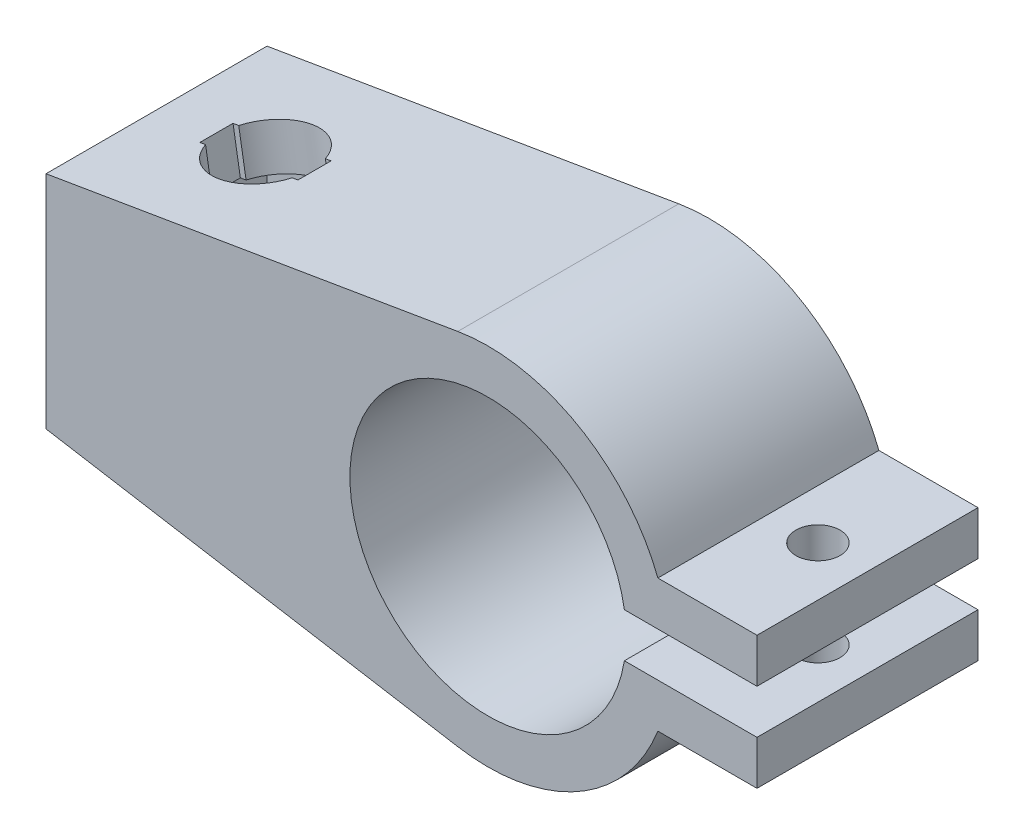
ISO-10303-21;
HEADER;
FILE_DESCRIPTION(('STEP AP214'),'2;1');
FILE_NAME('part.step','',(''),(''),'','','');
FILE_SCHEMA(('AUTOMOTIVE_DESIGN { 1 0 10303 214 1 1 1 1 }'));
ENDSEC;
DATA;
#1=APPLICATION_CONTEXT('core data for automotive mechanical design processes');
#2=APPLICATION_PROTOCOL_DEFINITION('international standard','automotive_design',2000,#1);
#3=PRODUCT_CONTEXT('',#1,'mechanical');
#4=PRODUCT('Part','Part','',(#3));
#5=PRODUCT_RELATED_PRODUCT_CATEGORY('part','',(#4));
#6=PRODUCT_DEFINITION_FORMATION('','',#4);
#7=PRODUCT_DEFINITION_CONTEXT('part definition',#1,'design');
#8=PRODUCT_DEFINITION('design','',#6,#7);
#9=PRODUCT_DEFINITION_SHAPE('','',#8);
#10=(LENGTH_UNIT() NAMED_UNIT(*) SI_UNIT(.MILLI.,.METRE.));
#11=(NAMED_UNIT(*) PLANE_ANGLE_UNIT() SI_UNIT($,.RADIAN.));
#12=(NAMED_UNIT(*) SI_UNIT($,.STERADIAN.) SOLID_ANGLE_UNIT());
#13=UNCERTAINTY_MEASURE_WITH_UNIT(LENGTH_MEASURE(1.E-05),#10,'distance_accuracy_value','');
#14=(GEOMETRIC_REPRESENTATION_CONTEXT(3) GLOBAL_UNCERTAINTY_ASSIGNED_CONTEXT((#13)) GLOBAL_UNIT_ASSIGNED_CONTEXT((#10,
#11,#12)) REPRESENTATION_CONTEXT('',''));
#15=CARTESIAN_POINT('',(0.,0.,0.));
#16=DIRECTION('',(0.,0.,1.));
#17=DIRECTION('',(1.,0.,0.));
#18=AXIS2_PLACEMENT_3D('',#15,#16,#17);
#19=CARTESIAN_POINT('',(0.,0.,20.));
#20=DIRECTION('',(0.,0.,-1.));
#21=DIRECTION('',(-1.,0.,0.));
#22=AXIS2_PLACEMENT_3D('',#19,#20,#21);
#23=CYLINDRICAL_SURFACE('',#22,16.5);
#24=CARTESIAN_POINT('',(0.,0.,0.));
#25=DIRECTION('',(0.,0.,1.));
#26=DIRECTION('',(1.,0.,0.));
#27=AXIS2_PLACEMENT_3D('',#24,#25,#26);
#28=CIRCLE('',#27,16.5);
#29=CARTESIAN_POINT('',(-2.73845848360588,-16.2711660655765,0.));
#30=VERTEX_POINT('',#29);
#31=CARTESIAN_POINT('',(15.3704261489394,-6.,0.));
#32=VERTEX_POINT('',#31);
#33=EDGE_CURVE('E61',#30,#32,#28,.T.);
#34=ORIENTED_EDGE('',*,*,#33,.T.);
#35=DIRECTION('',(0.,0.,-1.));
#36=VECTOR('',#35,1.);
#37=CARTESIAN_POINT('',(15.3704261489394,-6.,20.));
#38=LINE('',#37,#36);
#39=CARTESIAN_POINT('',(15.3704261489394,-6.,20.));
#40=VERTEX_POINT('',#39);
#41=EDGE_CURVE('E56',#32,#40,#38,.F.);
#42=ORIENTED_EDGE('',*,*,#41,.T.);
#43=CARTESIAN_POINT('',(0.,0.,20.));
#44=DIRECTION('',(0.,0.,1.));
#45=DIRECTION('',(1.,0.,0.));
#46=AXIS2_PLACEMENT_3D('',#43,#44,#45);
#47=CIRCLE('',#46,16.5);
#48=CARTESIAN_POINT('',(-2.73845848360588,-16.2711660655765,20.));
#49=VERTEX_POINT('',#48);
#50=EDGE_CURVE('E207',#49,#40,#47,.T.);
#51=ORIENTED_EDGE('',*,*,#50,.F.);
#52=DIRECTION('',(0.,0.,-1.));
#53=VECTOR('',#52,1.);
#54=CARTESIAN_POINT('',(-2.73845848360588,-16.2711660655765,20.));
#55=LINE('',#54,#53);
#56=CARTESIAN_POINT('',(-2.73845848360588,-16.2711660655765,16.));
#57=VERTEX_POINT('',#56);
#58=EDGE_CURVE('E400',#49,#57,#55,.T.);
#59=ORIENTED_EDGE('',*,*,#58,.T.);
#60=CARTESIAN_POINT('',(0.,0.,16.));
#61=DIRECTION('',(0.,0.,1.));
#62=DIRECTION('',(1.,0.,0.));
#63=AXIS2_PLACEMENT_3D('',#60,#61,#62);
#64=CIRCLE('',#63,16.5);
#65=CARTESIAN_POINT('',(-12.6955486533237,10.5391197161381,16.));
#66=VERTEX_POINT('',#65);
#67=EDGE_CURVE('E338',#66,#57,#64,.T.);
#68=ORIENTED_EDGE('',*,*,#67,.F.);
#69=DIRECTION('',(0.,0.,-1.));
#70=VECTOR('',#69,1.);
#71=CARTESIAN_POINT('',(-12.6955486533237,10.5391197161381,20.));
#72=LINE('',#71,#70);
#73=CARTESIAN_POINT('',(-12.6955486533237,10.5391197161381,4.));
#74=VERTEX_POINT('',#73);
#75=EDGE_CURVE('E354',#66,#74,#72,.T.);
#76=ORIENTED_EDGE('',*,*,#75,.T.);
#77=CARTESIAN_POINT('',(0.,0.,4.));
#78=DIRECTION('',(0.,0.,1.));
#79=DIRECTION('',(1.,0.,0.));
#80=AXIS2_PLACEMENT_3D('',#77,#78,#79);
#81=CIRCLE('',#80,16.5);
#82=CARTESIAN_POINT('',(-2.73845848360588,-16.2711660655765,4.));
#83=VERTEX_POINT('',#82);
#84=EDGE_CURVE('E307',#74,#83,#81,.T.);
#85=ORIENTED_EDGE('',*,*,#84,.T.);
#86=EDGE_CURVE('E387',#83,#30,#55,.T.);
#87=ORIENTED_EDGE('',*,*,#86,.T.);
#88=EDGE_LOOP('',(#34,#42,#51,#59,#68,#76,#85,#87));
#89=FACE_BOUND('',#88,.T.);
#90=ADVANCED_FACE('F39',(#89),#23,.T.);
#91=CARTESIAN_POINT('',(-40.,-10.,20.));
#92=DIRECTION('',(0.165967180824599,0.986131276701604,0.));
#93=DIRECTION('',(-0.986131276701604,0.165967180824599,0.));
#94=AXIS2_PLACEMENT_3D('',#91,#92,#93);
#95=PLANE('',#94);
#96=DIRECTION('',(0.986131276701604,-0.165967180824599,0.));
#97=VECTOR('',#96,1.);
#98=CARTESIAN_POINT('',(-40.,-10.,4.));
#99=LINE('',#98,#97);
#100=CARTESIAN_POINT('',(-36.,-10.6732052202207,4.));
#101=VERTEX_POINT('',#100);
#102=EDGE_CURVE('E333',#101,#83,#99,.T.);
#103=ORIENTED_EDGE('',*,*,#102,.F.);
#104=DIRECTION('',(0.,0.,-1.));
#105=VECTOR('',#104,1.);
#106=CARTESIAN_POINT('',(-36.,-10.6732052202207,20.));
#107=LINE('',#106,#105);
#108=CARTESIAN_POINT('',(-36.,-10.6732052202207,16.));
#109=VERTEX_POINT('',#108);
#110=EDGE_CURVE('E355',#109,#101,#107,.T.);
#111=ORIENTED_EDGE('',*,*,#110,.F.);
#112=DIRECTION('',(0.986131276701604,-0.165967180824599,0.));
#113=VECTOR('',#112,1.);
#114=CARTESIAN_POINT('',(-40.,-10.,16.));
#115=LINE('',#114,#113);
#116=EDGE_CURVE('E337',#109,#57,#115,.T.);
#117=ORIENTED_EDGE('',*,*,#116,.T.);
#118=ORIENTED_EDGE('',*,*,#58,.F.);
#119=DIRECTION('',(0.986131276701604,-0.165967180824599,0.));
#120=VECTOR('',#119,1.);
#121=CARTESIAN_POINT('',(-40.,-10.,20.));
#122=LINE('',#121,#120);
#123=CARTESIAN_POINT('',(-40.,-10.,20.));
#124=VERTEX_POINT('',#123);
#125=EDGE_CURVE('E384',#124,#49,#122,.T.);
#126=ORIENTED_EDGE('',*,*,#125,.F.);
#127=DIRECTION('',(0.,0.,-1.));
#128=VECTOR('',#127,1.);
#129=CARTESIAN_POINT('',(-40.,-10.,20.));
#130=LINE('',#129,#128);
#131=CARTESIAN_POINT('',(-40.,-10.,0.));
#132=VERTEX_POINT('',#131);
#133=EDGE_CURVE('E404',#124,#132,#130,.T.);
#134=ORIENTED_EDGE('',*,*,#133,.T.);
#135=DIRECTION('',(0.986131276701604,-0.165967180824599,0.));
#136=VECTOR('',#135,1.);
#137=CARTESIAN_POINT('',(-40.,-10.,0.));
#138=LINE('',#137,#136);
#139=EDGE_CURVE('E396',#132,#30,#138,.T.);
#140=ORIENTED_EDGE('',*,*,#139,.T.);
#141=ORIENTED_EDGE('',*,*,#86,.F.);
#142=EDGE_LOOP('',(#103,#111,#117,#118,#126,#134,#140,#141));
#143=FACE_BOUND('',#142,.T.);
#144=ADVANCED_FACE('F505',(#143),#95,.F.);
#145=CARTESIAN_POINT('',(0.,0.,20.));
#146=DIRECTION('',(0.,0.,1.));
#147=DIRECTION('',(1.,0.,0.));
#148=AXIS2_PLACEMENT_3D('',#145,#146,#147);
#149=PLANE('',#148);
#150=DIRECTION('',(1.,0.,0.));
#151=VECTOR('',#150,1.);
#152=CARTESIAN_POINT('',(0.,-2.,20.));
#153=LINE('',#152,#151);
#154=CARTESIAN_POINT('',(12.3389626792531,-2.,20.));
#155=VERTEX_POINT('',#154);
#156=CARTESIAN_POINT('',(24.3389626792531,-2.,20.));
#157=VERTEX_POINT('',#156);
#158=EDGE_CURVE('E269',#155,#157,#153,.T.);
#159=ORIENTED_EDGE('',*,*,#158,.F.);
#160=CARTESIAN_POINT('',(0.,0.,20.));
#161=DIRECTION('',(0.,0.,1.));
#162=DIRECTION('',(1.,0.,0.));
#163=AXIS2_PLACEMENT_3D('',#160,#161,#162);
#164=CIRCLE('',#163,12.5);
#165=CARTESIAN_POINT('',(12.3389626792531,2.,20.));
#166=VERTEX_POINT('',#165);
#167=EDGE_CURVE('E367',#166,#155,#164,.T.);
#168=ORIENTED_EDGE('',*,*,#167,.F.);
#169=DIRECTION('',(-1.,0.,0.));
#170=VECTOR('',#169,1.);
#171=CARTESIAN_POINT('',(0.,2.,20.));
#172=LINE('',#171,#170);
#173=CARTESIAN_POINT('',(24.3389626792531,2.,20.));
#174=VERTEX_POINT('',#173);
#175=EDGE_CURVE('E266',#174,#166,#172,.T.);
#176=ORIENTED_EDGE('',*,*,#175,.F.);
#177=DIRECTION('',(0.,1.,0.));
#178=VECTOR('',#177,1.);
#179=CARTESIAN_POINT('',(24.3389626792531,2.,20.));
#180=LINE('',#179,#178);
#181=CARTESIAN_POINT('',(24.3389626792531,6.,20.));
#182=VERTEX_POINT('',#181);
#183=EDGE_CURVE('E237',#174,#182,#180,.T.);
#184=ORIENTED_EDGE('',*,*,#183,.T.);
#185=DIRECTION('',(-1.,0.,0.));
#186=VECTOR('',#185,1.);
#187=CARTESIAN_POINT('',(12.3389626792531,6.,20.));
#188=LINE('',#187,#186);
#189=CARTESIAN_POINT('',(15.3704261489394,6.,20.));
#190=VERTEX_POINT('',#189);
#191=EDGE_CURVE('E250',#182,#190,#188,.T.);
#192=ORIENTED_EDGE('',*,*,#191,.T.);
#193=CARTESIAN_POINT('',(-2.73845848360588,16.2711660655765,20.));
#194=VERTEX_POINT('',#193);
#195=EDGE_CURVE('E378',#190,#194,#47,.T.);
#196=ORIENTED_EDGE('',*,*,#195,.T.);
#197=DIRECTION('',(-0.986131276701604,-0.165967180824599,0.));
#198=VECTOR('',#197,1.);
#199=CARTESIAN_POINT('',(-2.73845848360588,16.2711660655765,20.));
#200=LINE('',#199,#198);
#201=CARTESIAN_POINT('',(-40.,10.,20.));
#202=VERTEX_POINT('',#201);
#203=EDGE_CURVE('E377',#194,#202,#200,.T.);
#204=ORIENTED_EDGE('',*,*,#203,.T.);
#205=DIRECTION('',(0.,-1.,0.));
#206=VECTOR('',#205,1.);
#207=CARTESIAN_POINT('',(-40.,10.,20.));
#208=LINE('',#207,#206);
#209=EDGE_CURVE('E381',#202,#124,#208,.T.);
#210=ORIENTED_EDGE('',*,*,#209,.T.);
#211=ORIENTED_EDGE('',*,*,#125,.T.);
#212=ORIENTED_EDGE('',*,*,#50,.T.);
#213=DIRECTION('',(1.,0.,0.));
#214=VECTOR('',#213,1.);
#215=CARTESIAN_POINT('',(12.3389626792531,-6.,20.));
#216=LINE('',#215,#214);
#217=CARTESIAN_POINT('',(24.3389626792531,-6.,20.));
#218=VERTEX_POINT('',#217);
#219=EDGE_CURVE('E201',#40,#218,#216,.T.);
#220=ORIENTED_EDGE('',*,*,#219,.T.);
#221=DIRECTION('',(0.,1.,0.));
#222=VECTOR('',#221,1.);
#223=CARTESIAN_POINT('',(24.3389626792531,-2.,20.));
#224=LINE('',#223,#222);
#225=EDGE_CURVE('E206',#218,#157,#224,.T.);
#226=ORIENTED_EDGE('',*,*,#225,.T.);
#227=EDGE_LOOP('',(#159,#168,#176,#184,#192,#196,#204,#210,#211,#212,#220,#226));
#228=FACE_BOUND('',#227,.T.);
#229=ADVANCED_FACE('F204',(#228),#149,.T.);
#230=CARTESIAN_POINT('',(0.,0.,0.));
#231=DIRECTION('',(0.,0.,1.));
#232=DIRECTION('',(1.,0.,0.));
#233=AXIS2_PLACEMENT_3D('',#230,#231,#232);
#234=PLANE('',#233);
#235=CARTESIAN_POINT('',(0.,0.,0.));
#236=DIRECTION('',(0.,0.,1.));
#237=DIRECTION('',(1.,0.,0.));
#238=AXIS2_PLACEMENT_3D('',#235,#236,#237);
#239=CIRCLE('',#238,12.5);
#240=CARTESIAN_POINT('',(12.3389626792531,2.,0.));
#241=VERTEX_POINT('',#240);
#242=CARTESIAN_POINT('',(12.3389626792531,-2.,0.));
#243=VERTEX_POINT('',#242);
#244=EDGE_CURVE('E366',#241,#243,#239,.T.);
#245=ORIENTED_EDGE('',*,*,#244,.T.);
#246=DIRECTION('',(1.,0.,0.));
#247=VECTOR('',#246,1.);
#248=CARTESIAN_POINT('',(10.4777413587402,-2.,0.));
#249=LINE('',#248,#247);
#250=CARTESIAN_POINT('',(24.3389626792531,-2.,0.));
#251=VERTEX_POINT('',#250);
#252=EDGE_CURVE('E263',#243,#251,#249,.T.);
#253=ORIENTED_EDGE('',*,*,#252,.T.);
#254=DIRECTION('',(0.,-1.,0.));
#255=VECTOR('',#254,1.);
#256=CARTESIAN_POINT('',(24.3389626792531,-2.,0.));
#257=LINE('',#256,#255);
#258=CARTESIAN_POINT('',(24.3389626792531,-6.,0.));
#259=VERTEX_POINT('',#258);
#260=EDGE_CURVE('E231',#251,#259,#257,.T.);
#261=ORIENTED_EDGE('',*,*,#260,.T.);
#262=DIRECTION('',(-1.,0.,0.));
#263=VECTOR('',#262,1.);
#264=CARTESIAN_POINT('',(12.3389626792531,-6.,0.));
#265=LINE('',#264,#263);
#266=EDGE_CURVE('E217',#259,#32,#265,.T.);
#267=ORIENTED_EDGE('',*,*,#266,.T.);
#268=ORIENTED_EDGE('',*,*,#33,.F.);
#269=ORIENTED_EDGE('',*,*,#139,.F.);
#270=DIRECTION('',(0.,-1.,0.));
#271=VECTOR('',#270,1.);
#272=CARTESIAN_POINT('',(-40.,10.,0.));
#273=LINE('',#272,#271);
#274=CARTESIAN_POINT('',(-40.,10.,0.));
#275=VERTEX_POINT('',#274);
#276=EDGE_CURVE('E393',#275,#132,#273,.T.);
#277=ORIENTED_EDGE('',*,*,#276,.F.);
#278=DIRECTION('',(-0.986131276701604,-0.165967180824599,0.));
#279=VECTOR('',#278,1.);
#280=CARTESIAN_POINT('',(-2.73845848360588,16.2711660655765,0.));
#281=LINE('',#280,#279);
#282=CARTESIAN_POINT('',(-2.73845848360588,16.2711660655765,0.));
#283=VERTEX_POINT('',#282);
#284=EDGE_CURVE('E390',#283,#275,#281,.T.);
#285=ORIENTED_EDGE('',*,*,#284,.F.);
#286=CARTESIAN_POINT('',(15.3704261489394,6.,0.));
#287=VERTEX_POINT('',#286);
#288=EDGE_CURVE('E371',#287,#283,#28,.T.);
#289=ORIENTED_EDGE('',*,*,#288,.F.);
#290=DIRECTION('',(1.,0.,0.));
#291=VECTOR('',#290,1.);
#292=CARTESIAN_POINT('',(12.3389626792531,6.,0.));
#293=LINE('',#292,#291);
#294=CARTESIAN_POINT('',(24.3389626792531,6.,0.));
#295=VERTEX_POINT('',#294);
#296=EDGE_CURVE('E242',#287,#295,#293,.T.);
#297=ORIENTED_EDGE('',*,*,#296,.T.);
#298=DIRECTION('',(0.,-1.,0.));
#299=VECTOR('',#298,1.);
#300=CARTESIAN_POINT('',(24.3389626792531,2.,0.));
#301=LINE('',#300,#299);
#302=CARTESIAN_POINT('',(24.3389626792531,2.,0.));
#303=VERTEX_POINT('',#302);
#304=EDGE_CURVE('E238',#295,#303,#301,.T.);
#305=ORIENTED_EDGE('',*,*,#304,.T.);
#306=DIRECTION('',(-1.,0.,0.));
#307=VECTOR('',#306,1.);
#308=CARTESIAN_POINT('',(10.4777413587402,2.,0.));
#309=LINE('',#308,#307);
#310=EDGE_CURVE('E246',#303,#241,#309,.T.);
#311=ORIENTED_EDGE('',*,*,#310,.T.);
#312=EDGE_LOOP('',(#245,#253,#261,#267,#268,#269,#277,#285,#289,#297,#305,#311));
#313=FACE_BOUND('',#312,.T.);
#314=ADVANCED_FACE('F456',(#313),#234,.F.);
#315=ORIENTED_EDGE('',*,*,#195,.F.);
#316=DIRECTION('',(0.,0.,-1.));
#317=VECTOR('',#316,1.);
#318=CARTESIAN_POINT('',(15.3704261489394,6.,20.));
#319=LINE('',#318,#317);
#320=EDGE_CURVE('E11',#190,#287,#319,.T.);
#321=ORIENTED_EDGE('',*,*,#320,.T.);
#322=ORIENTED_EDGE('',*,*,#288,.T.);
#323=DIRECTION('',(0.,0.,-1.));
#324=VECTOR('',#323,1.);
#325=CARTESIAN_POINT('',(-2.73845848360588,16.2711660655765,20.));
#326=LINE('',#325,#324);
#327=EDGE_CURVE('E412',#194,#283,#326,.T.);
#328=ORIENTED_EDGE('',*,*,#327,.F.);
#329=EDGE_LOOP('',(#315,#321,#322,#328));
#330=FACE_BOUND('',#329,.T.);
#331=ADVANCED_FACE('F41',(#330),#23,.T.);
#332=CARTESIAN_POINT('',(-2.73845848360588,16.2711660655765,20.));
#333=DIRECTION('',(0.165967180824599,-0.986131276701604,0.));
#334=DIRECTION('',(0.986131276701604,0.165967180824599,0.));
#335=AXIS2_PLACEMENT_3D('',#332,#333,#334);
#336=PLANE('',#335);
#337=DIRECTION('',(-0.986131276701604,-0.165967180824599,0.));
#338=VECTOR('',#337,1.);
#339=CARTESIAN_POINT('',(-26.2173426899178,12.319639212415,8.5));
#340=LINE('',#339,#338);
#341=CARTESIAN_POINT('',(-25.7010964878267,12.4065241219567,8.5));
#342=VERTEX_POINT('',#341);
#343=CARTESIAN_POINT('',(-26.2173426899178,12.319639212415,8.5));
#344=VERTEX_POINT('',#343);
#345=EDGE_CURVE('E275',#342,#344,#340,.T.);
#346=ORIENTED_EDGE('',*,*,#345,.F.);
#347=DIRECTION('',(0.,0.,-1.));
#348=VECTOR('',#347,1.);
#349=CARTESIAN_POINT('',(-25.7010964878267,12.4065241219567,11.5));
#350=LINE('',#349,#348);
#351=CARTESIAN_POINT('',(-25.7010964878267,12.4065241219567,11.5));
#352=VERTEX_POINT('',#351);
#353=EDGE_CURVE('E272',#352,#342,#350,.T.);
#354=ORIENTED_EDGE('',*,*,#353,.F.);
#355=DIRECTION('',(0.986131276701604,0.165967180824597,0.));
#356=VECTOR('',#355,1.);
#357=CARTESIAN_POINT('',(-26.2173426899178,12.319639212415,11.5));
#358=LINE('',#357,#356);
#359=CARTESIAN_POINT('',(-26.2173426899178,12.319639212415,11.5));
#360=VERTEX_POINT('',#359);
#361=EDGE_CURVE('E299',#360,#352,#358,.T.);
#362=ORIENTED_EDGE('',*,*,#361,.F.);
#363=CARTESIAN_POINT('',(-30.138687232984,11.659671808246,10.));
#364=DIRECTION('',(-0.165967180824599,0.986131276701604,0.));
#365=DIRECTION('',(-0.986131276701604,-0.165967180824599,0.));
#366=AXIS2_PLACEMENT_3D('',#363,#364,#365);
#367=CIRCLE('',#366,4.25);
#368=CARTESIAN_POINT('',(-34.0600317760501,10.999704404077,11.5));
#369=VERTEX_POINT('',#368);
#370=EDGE_CURVE('E295',#369,#360,#367,.T.);
#371=ORIENTED_EDGE('',*,*,#370,.F.);
#372=DIRECTION('',(0.986131276701603,0.1659671808246,0.));
#373=VECTOR('',#372,1.);
#374=CARTESIAN_POINT('',(-34.5762779781412,10.9128194945353,11.5));
#375=LINE('',#374,#373);
#376=CARTESIAN_POINT('',(-34.5762779781412,10.9128194945353,11.5));
#377=VERTEX_POINT('',#376);
#378=EDGE_CURVE('E291',#377,#369,#375,.T.);
#379=ORIENTED_EDGE('',*,*,#378,.F.);
#380=DIRECTION('',(0.,0.,1.));
#381=VECTOR('',#380,1.);
#382=CARTESIAN_POINT('',(-34.5762779781412,10.9128194945353,11.5));
#383=LINE('',#382,#381);
#384=CARTESIAN_POINT('',(-34.5762779781412,10.9128194945353,8.5));
#385=VERTEX_POINT('',#384);
#386=EDGE_CURVE('E287',#385,#377,#383,.T.);
#387=ORIENTED_EDGE('',*,*,#386,.F.);
#388=DIRECTION('',(-0.986131276701603,-0.1659671808246,0.));
#389=VECTOR('',#388,1.);
#390=CARTESIAN_POINT('',(-34.5762779781412,10.9128194945353,8.5));
#391=LINE('',#390,#389);
#392=CARTESIAN_POINT('',(-34.0600317760501,10.999704404077,8.5));
#393=VERTEX_POINT('',#392);
#394=EDGE_CURVE('E283',#393,#385,#391,.T.);
#395=ORIENTED_EDGE('',*,*,#394,.F.);
#396=CARTESIAN_POINT('',(-30.138687232984,11.659671808246,10.));
#397=DIRECTION('',(-0.165967180824599,0.986131276701604,0.));
#398=DIRECTION('',(-0.986131276701604,-0.165967180824599,0.));
#399=AXIS2_PLACEMENT_3D('',#396,#397,#398);
#400=CIRCLE('',#399,4.25);
#401=EDGE_CURVE('E279',#344,#393,#400,.T.);
#402=ORIENTED_EDGE('',*,*,#401,.F.);
#403=EDGE_LOOP('',(#346,#354,#362,#371,#379,#387,#395,#402));
#404=FACE_BOUND('',#403,.T.);
#405=ORIENTED_EDGE('',*,*,#284,.T.);
#406=DIRECTION('',(0.,0.,-1.));
#407=VECTOR('',#406,1.);
#408=CARTESIAN_POINT('',(-40.,10.,20.));
#409=LINE('',#408,#407);
#410=EDGE_CURVE('E408',#202,#275,#409,.T.);
#411=ORIENTED_EDGE('',*,*,#410,.F.);
#412=ORIENTED_EDGE('',*,*,#203,.F.);
#413=ORIENTED_EDGE('',*,*,#327,.T.);
#414=EDGE_LOOP('',(#405,#411,#412,#413));
#415=FACE_BOUND('',#414,.T.);
#416=ADVANCED_FACE('F512',(#404,#415),#336,.F.);
#417=CARTESIAN_POINT('',(-40.,10.,20.));
#418=DIRECTION('',(1.,0.,0.));
#419=DIRECTION('',(0.,0.,-1.));
#420=AXIS2_PLACEMENT_3D('',#417,#418,#419);
#421=PLANE('',#420);
#422=ORIENTED_EDGE('',*,*,#276,.T.);
#423=ORIENTED_EDGE('',*,*,#133,.F.);
#424=ORIENTED_EDGE('',*,*,#209,.F.);
#425=ORIENTED_EDGE('',*,*,#410,.T.);
#426=EDGE_LOOP('',(#422,#423,#424,#425));
#427=FACE_BOUND('',#426,.T.);
#428=ADVANCED_FACE('F517',(#427),#421,.F.);
#429=CARTESIAN_POINT('',(0.,0.,20.));
#430=DIRECTION('',(0.,0.,-1.));
#431=DIRECTION('',(-1.,0.,0.));
#432=AXIS2_PLACEMENT_3D('',#429,#430,#431);
#433=CYLINDRICAL_SURFACE('',#432,12.5);
#434=DIRECTION('',(0.,0.,-1.));
#435=VECTOR('',#434,1.);
#436=CARTESIAN_POINT('',(12.3389626792531,-2.,20.));
#437=LINE('',#436,#435);
#438=EDGE_CURVE('E49',#243,#155,#437,.F.);
#439=ORIENTED_EDGE('',*,*,#438,.F.);
#440=ORIENTED_EDGE('',*,*,#244,.F.);
#441=DIRECTION('',(0.,0.,-1.));
#442=VECTOR('',#441,1.);
#443=CARTESIAN_POINT('',(12.3389626792531,2.,20.));
#444=LINE('',#443,#442);
#445=EDGE_CURVE('E441',#166,#241,#444,.T.);
#446=ORIENTED_EDGE('',*,*,#445,.F.);
#447=ORIENTED_EDGE('',*,*,#167,.T.);
#448=EDGE_LOOP('',(#439,#440,#446,#447));
#449=FACE_BOUND('',#448,.T.);
#450=ADVANCED_FACE('F452',(#449),#433,.F.);
#451=CARTESIAN_POINT('',(0.,0.,16.));
#452=DIRECTION('',(0.,0.,1.));
#453=DIRECTION('',(1.,0.,0.));
#454=AXIS2_PLACEMENT_3D('',#451,#452,#453);
#455=PLANE('',#454);
#456=ORIENTED_EDGE('',*,*,#67,.T.);
#457=ORIENTED_EDGE('',*,*,#116,.F.);
#458=DIRECTION('',(0.,-1.,0.));
#459=VECTOR('',#458,1.);
#460=CARTESIAN_POINT('',(-36.,10.,16.));
#461=LINE('',#460,#459);
#462=CARTESIAN_POINT('',(-36.,6.61695014089783,16.));
#463=VERTEX_POINT('',#462);
#464=EDGE_CURVE('E332',#463,#109,#461,.T.);
#465=ORIENTED_EDGE('',*,*,#464,.F.);
#466=DIRECTION('',(-0.986131276701604,-0.165967180824599,0.));
#467=VECTOR('',#466,1.);
#468=CARTESIAN_POINT('',(-2.07458976030749,12.32664095877,16.));
#469=LINE('',#468,#467);
#470=EDGE_CURVE('E329',#66,#463,#469,.T.);
#471=ORIENTED_EDGE('',*,*,#470,.F.);
#472=EDGE_LOOP('',(#456,#457,#465,#471));
#473=FACE_BOUND('',#472,.T.);
#474=ADVANCED_FACE('F531',(#473),#455,.F.);
#475=CARTESIAN_POINT('',(0.,0.,4.));
#476=DIRECTION('',(0.,0.,1.));
#477=DIRECTION('',(1.,0.,0.));
#478=AXIS2_PLACEMENT_3D('',#475,#476,#477);
#479=PLANE('',#478);
#480=ORIENTED_EDGE('',*,*,#84,.F.);
#481=DIRECTION('',(-0.986131276701604,-0.165967180824599,0.));
#482=VECTOR('',#481,1.);
#483=CARTESIAN_POINT('',(-2.07458976030749,12.32664095877,4.));
#484=LINE('',#483,#482);
#485=CARTESIAN_POINT('',(-36.,6.61695014089783,4.));
#486=VERTEX_POINT('',#485);
#487=EDGE_CURVE('E341',#74,#486,#484,.T.);
#488=ORIENTED_EDGE('',*,*,#487,.T.);
#489=DIRECTION('',(0.,-1.,0.));
#490=VECTOR('',#489,1.);
#491=CARTESIAN_POINT('',(-36.,10.,4.));
#492=LINE('',#491,#490);
#493=EDGE_CURVE('E342',#486,#101,#492,.T.);
#494=ORIENTED_EDGE('',*,*,#493,.T.);
#495=ORIENTED_EDGE('',*,*,#102,.T.);
#496=EDGE_LOOP('',(#480,#488,#494,#495));
#497=FACE_BOUND('',#496,.T.);
#498=ADVANCED_FACE('F556',(#497),#479,.T.);
#499=CARTESIAN_POINT('',(-2.07458976030749,12.32664095877,20.));
#500=DIRECTION('',(0.165967180824599,-0.986131276701604,0.));
#501=DIRECTION('',(0.986131276701604,0.165967180824599,0.));
#502=AXIS2_PLACEMENT_3D('',#499,#500,#501);
#503=PLANE('',#502);
#504=DIRECTION('',(0.,0.,1.));
#505=VECTOR('',#504,1.);
#506=CARTESIAN_POINT('',(-25.0372277645284,8.46199901515027,20.));
#507=LINE('',#506,#505);
#508=CARTESIAN_POINT('',(-25.0372277645284,8.46199901515027,8.5));
#509=VERTEX_POINT('',#508);
#510=CARTESIAN_POINT('',(-25.0372277645284,8.46199901515027,11.5));
#511=VERTEX_POINT('',#510);
#512=EDGE_CURVE('E438',#509,#511,#507,.T.);
#513=ORIENTED_EDGE('',*,*,#512,.F.);
#514=DIRECTION('',(0.986131276701604,0.165967180824599,0.));
#515=VECTOR('',#514,1.);
#516=CARTESIAN_POINT('',(-2.07458976030752,12.32664095877,8.49999999999992));
#517=LINE('',#516,#515);
#518=CARTESIAN_POINT('',(-25.5534739666194,8.37511410560856,8.5));
#519=VERTEX_POINT('',#518);
#520=EDGE_CURVE('E416',#519,#509,#517,.T.);
#521=ORIENTED_EDGE('',*,*,#520,.F.);
#522=CARTESIAN_POINT('',(-29.4748185096856,7.71514670143957,10.));
#523=DIRECTION('',(0.165967180824599,-0.986131276701604,0.));
#524=DIRECTION('',(0.986131276701604,0.165967180824599,0.));
#525=AXIS2_PLACEMENT_3D('',#522,#523,#524);
#526=CIRCLE('',#525,4.25);
#527=CARTESIAN_POINT('',(-33.3961630527517,7.05517929727058,8.5));
#528=VERTEX_POINT('',#527);
#529=EDGE_CURVE('E419',#528,#519,#526,.T.);
#530=ORIENTED_EDGE('',*,*,#529,.F.);
#531=DIRECTION('',(0.986131276701604,0.165967180824599,0.));
#532=VECTOR('',#531,1.);
#533=CARTESIAN_POINT('',(-2.07458976030745,12.32664095877,8.50000000000011));
#534=LINE('',#533,#532);
#535=CARTESIAN_POINT('',(-33.9124092548428,6.96829438772888,8.5));
#536=VERTEX_POINT('',#535);
#537=EDGE_CURVE('E423',#536,#528,#534,.T.);
#538=ORIENTED_EDGE('',*,*,#537,.F.);
#539=DIRECTION('',(0.,0.,-1.));
#540=VECTOR('',#539,1.);
#541=CARTESIAN_POINT('',(-33.9124092548428,6.96829438772888,20.));
#542=LINE('',#541,#540);
#543=CARTESIAN_POINT('',(-33.9124092548428,6.96829438772888,11.5));
#544=VERTEX_POINT('',#543);
#545=EDGE_CURVE('E426',#544,#536,#542,.T.);
#546=ORIENTED_EDGE('',*,*,#545,.F.);
#547=DIRECTION('',(-0.986131276701604,-0.165967180824599,0.));
#548=VECTOR('',#547,1.);
#549=CARTESIAN_POINT('',(-2.07458976030749,12.32664095877,11.5));
#550=LINE('',#549,#548);
#551=CARTESIAN_POINT('',(-33.3961630527517,7.05517929727058,11.5));
#552=VERTEX_POINT('',#551);
#553=EDGE_CURVE('E429',#552,#544,#550,.T.);
#554=ORIENTED_EDGE('',*,*,#553,.F.);
#555=CARTESIAN_POINT('',(-29.4748185096856,7.71514670143957,10.));
#556=DIRECTION('',(0.165967180824599,-0.986131276701604,0.));
#557=DIRECTION('',(0.986131276701604,0.165967180824599,0.));
#558=AXIS2_PLACEMENT_3D('',#555,#556,#557);
#559=CIRCLE('',#558,4.25);
#560=CARTESIAN_POINT('',(-25.5534739666195,8.37511410560856,11.5));
#561=VERTEX_POINT('',#560);
#562=EDGE_CURVE('E432',#561,#552,#559,.T.);
#563=ORIENTED_EDGE('',*,*,#562,.F.);
#564=DIRECTION('',(-0.986131276701604,-0.165967180824599,0.));
#565=VECTOR('',#564,1.);
#566=CARTESIAN_POINT('',(-2.07458976030749,12.32664095877,11.5));
#567=LINE('',#566,#565);
#568=EDGE_CURVE('E435',#511,#561,#567,.T.);
#569=ORIENTED_EDGE('',*,*,#568,.F.);
#570=EDGE_LOOP('',(#513,#521,#530,#538,#546,#554,#563,#569));
#571=FACE_BOUND('',#570,.T.);
#572=ORIENTED_EDGE('',*,*,#470,.T.);
#573=DIRECTION('',(0.,0.,-1.));
#574=VECTOR('',#573,1.);
#575=CARTESIAN_POINT('',(-36.,6.61695014089783,20.));
#576=LINE('',#575,#574);
#577=EDGE_CURVE('E350',#463,#486,#576,.T.);
#578=ORIENTED_EDGE('',*,*,#577,.T.);
#579=ORIENTED_EDGE('',*,*,#487,.F.);
#580=ORIENTED_EDGE('',*,*,#75,.F.);
#581=EDGE_LOOP('',(#572,#578,#579,#580));
#582=FACE_BOUND('',#581,.T.);
#583=ADVANCED_FACE('F550',(#571,#582),#503,.T.);
#584=CARTESIAN_POINT('',(-36.,10.,20.));
#585=DIRECTION('',(1.,0.,0.));
#586=DIRECTION('',(0.,0.,-1.));
#587=AXIS2_PLACEMENT_3D('',#584,#585,#586);
#588=PLANE('',#587);
#589=ORIENTED_EDGE('',*,*,#493,.F.);
#590=ORIENTED_EDGE('',*,*,#577,.F.);
#591=ORIENTED_EDGE('',*,*,#464,.T.);
#592=ORIENTED_EDGE('',*,*,#110,.T.);
#593=EDGE_LOOP('',(#589,#590,#591,#592));
#594=FACE_BOUND('',#593,.T.);
#595=ADVANCED_FACE('F554',(#594),#588,.T.);
#596=CARTESIAN_POINT('',(-24.8712605837038,7.47586773844867,11.5));
#597=DIRECTION('',(0.986131276701604,0.165967180824599,0.));
#598=DIRECTION('',(-0.165967180824599,0.986131276701604,0.));
#599=AXIS2_PLACEMENT_3D('',#596,#597,#598);
#600=PLANE('',#599);
#601=ORIENTED_EDGE('',*,*,#512,.T.);
#602=DIRECTION('',(-0.165967180824599,0.986131276701604,0.));
#603=VECTOR('',#602,1.);
#604=CARTESIAN_POINT('',(-24.8712605837038,7.47586773844867,11.5));
#605=LINE('',#604,#603);
#606=EDGE_CURVE('E304',#511,#352,#605,.T.);
#607=ORIENTED_EDGE('',*,*,#606,.T.);
#608=ORIENTED_EDGE('',*,*,#353,.T.);
#609=DIRECTION('',(-0.165967180824599,0.986131276701604,0.));
#610=VECTOR('',#609,1.);
#611=CARTESIAN_POINT('',(-24.8712605837038,7.47586773844867,8.5));
#612=LINE('',#611,#610);
#613=EDGE_CURVE('E303',#509,#342,#612,.T.);
#614=ORIENTED_EDGE('',*,*,#613,.F.);
#615=EDGE_LOOP('',(#601,#607,#608,#614));
#616=FACE_BOUND('',#615,.T.);
#617=ADVANCED_FACE('F570',(#616),#600,.F.);
#618=CARTESIAN_POINT('',(-25.3875067857949,7.38898282890696,11.5));
#619=DIRECTION('',(0.,0.,1.));
#620=DIRECTION('',(1.,0.,0.));
#621=AXIS2_PLACEMENT_3D('',#618,#619,#620);
#622=PLANE('',#621);
#623=ORIENTED_EDGE('',*,*,#568,.T.);
#624=DIRECTION('',(-0.165967180824599,0.986131276701604,0.));
#625=VECTOR('',#624,1.);
#626=CARTESIAN_POINT('',(-25.3875067857949,7.38898282890696,11.5));
#627=LINE('',#626,#625);
#628=EDGE_CURVE('E308',#561,#360,#627,.T.);
#629=ORIENTED_EDGE('',*,*,#628,.T.);
#630=ORIENTED_EDGE('',*,*,#361,.T.);
#631=ORIENTED_EDGE('',*,*,#606,.F.);
#632=EDGE_LOOP('',(#623,#629,#630,#631));
#633=FACE_BOUND('',#632,.T.);
#634=ADVANCED_FACE('F574',(#633),#622,.F.);
#635=CARTESIAN_POINT('',(-29.308851328861,6.72901542473797,10.));
#636=DIRECTION('',(-0.165967180824599,0.986131276701604,0.));
#637=DIRECTION('',(-0.986131276701604,-0.165967180824599,0.));
#638=AXIS2_PLACEMENT_3D('',#635,#636,#637);
#639=CYLINDRICAL_SURFACE('',#638,4.25);
#640=ORIENTED_EDGE('',*,*,#562,.T.);
#641=DIRECTION('',(-0.165967180824599,0.986131276701604,0.));
#642=VECTOR('',#641,1.);
#643=CARTESIAN_POINT('',(-33.2301958719271,6.06904802056898,11.5));
#644=LINE('',#643,#642);
#645=EDGE_CURVE('E311',#552,#369,#644,.T.);
#646=ORIENTED_EDGE('',*,*,#645,.T.);
#647=ORIENTED_EDGE('',*,*,#370,.T.);
#648=ORIENTED_EDGE('',*,*,#628,.F.);
#649=EDGE_LOOP('',(#640,#646,#647,#648));
#650=FACE_BOUND('',#649,.T.);
#651=ADVANCED_FACE('F579',(#650),#639,.F.);
#652=CARTESIAN_POINT('',(-33.7464420740182,5.98216311102728,11.5));
#653=DIRECTION('',(0.,0.,1.));
#654=DIRECTION('',(1.,0.,0.));
#655=AXIS2_PLACEMENT_3D('',#652,#653,#654);
#656=PLANE('',#655);
#657=ORIENTED_EDGE('',*,*,#553,.T.);
#658=DIRECTION('',(-0.165967180824599,0.986131276701604,0.));
#659=VECTOR('',#658,1.);
#660=CARTESIAN_POINT('',(-33.7464420740182,5.98216311102728,11.5));
#661=LINE('',#660,#659);
#662=EDGE_CURVE('E314',#544,#377,#661,.T.);
#663=ORIENTED_EDGE('',*,*,#662,.T.);
#664=ORIENTED_EDGE('',*,*,#378,.T.);
#665=ORIENTED_EDGE('',*,*,#645,.F.);
#666=EDGE_LOOP('',(#657,#663,#664,#665));
#667=FACE_BOUND('',#666,.T.);
#668=ADVANCED_FACE('F598',(#667),#656,.F.);
#669=CARTESIAN_POINT('',(-33.7464420740182,5.98216311102728,11.5));
#670=DIRECTION('',(-0.986131276701604,-0.165967180824599,0.));
#671=DIRECTION('',(0.165967180824599,-0.986131276701604,0.));
#672=AXIS2_PLACEMENT_3D('',#669,#670,#671);
#673=PLANE('',#672);
#674=ORIENTED_EDGE('',*,*,#545,.T.);
#675=DIRECTION('',(-0.165967180824599,0.986131276701604,0.));
#676=VECTOR('',#675,1.);
#677=CARTESIAN_POINT('',(-33.7464420740182,5.98216311102728,8.5));
#678=LINE('',#677,#676);
#679=EDGE_CURVE('E317',#536,#385,#678,.T.);
#680=ORIENTED_EDGE('',*,*,#679,.T.);
#681=ORIENTED_EDGE('',*,*,#386,.T.);
#682=ORIENTED_EDGE('',*,*,#662,.F.);
#683=EDGE_LOOP('',(#674,#680,#681,#682));
#684=FACE_BOUND('',#683,.T.);
#685=ADVANCED_FACE('F594',(#684),#673,.F.);
#686=CARTESIAN_POINT('',(-33.7464420740182,5.98216311102728,8.5));
#687=DIRECTION('',(0.,0.,-1.));
#688=DIRECTION('',(-1.,0.,0.));
#689=AXIS2_PLACEMENT_3D('',#686,#687,#688);
#690=PLANE('',#689);
#691=ORIENTED_EDGE('',*,*,#537,.T.);
#692=DIRECTION('',(-0.165967180824599,0.986131276701604,0.));
#693=VECTOR('',#692,1.);
#694=CARTESIAN_POINT('',(-33.2301958719271,6.06904802056898,8.5));
#695=LINE('',#694,#693);
#696=EDGE_CURVE('E320',#528,#393,#695,.T.);
#697=ORIENTED_EDGE('',*,*,#696,.T.);
#698=ORIENTED_EDGE('',*,*,#394,.T.);
#699=ORIENTED_EDGE('',*,*,#679,.F.);
#700=EDGE_LOOP('',(#691,#697,#698,#699));
#701=FACE_BOUND('',#700,.T.);
#702=ADVANCED_FACE('F590',(#701),#690,.F.);
#703=CARTESIAN_POINT('',(-29.308851328861,6.72901542473797,10.));
#704=DIRECTION('',(-0.165967180824599,0.986131276701604,0.));
#705=DIRECTION('',(-0.986131276701604,-0.165967180824599,0.));
#706=AXIS2_PLACEMENT_3D('',#703,#704,#705);
#707=CYLINDRICAL_SURFACE('',#706,4.25);
#708=ORIENTED_EDGE('',*,*,#529,.T.);
#709=DIRECTION('',(-0.165967180824599,0.986131276701604,0.));
#710=VECTOR('',#709,1.);
#711=CARTESIAN_POINT('',(-25.3875067857949,7.38898282890696,8.5));
#712=LINE('',#711,#710);
#713=EDGE_CURVE('E323',#519,#344,#712,.T.);
#714=ORIENTED_EDGE('',*,*,#713,.T.);
#715=ORIENTED_EDGE('',*,*,#401,.T.);
#716=ORIENTED_EDGE('',*,*,#696,.F.);
#717=EDGE_LOOP('',(#708,#714,#715,#716));
#718=FACE_BOUND('',#717,.T.);
#719=ADVANCED_FACE('F586',(#718),#707,.F.);
#720=CARTESIAN_POINT('',(-25.3875067857949,7.38898282890696,8.5));
#721=DIRECTION('',(0.,0.,-1.));
#722=DIRECTION('',(-1.,0.,0.));
#723=AXIS2_PLACEMENT_3D('',#720,#721,#722);
#724=PLANE('',#723);
#725=ORIENTED_EDGE('',*,*,#520,.T.);
#726=ORIENTED_EDGE('',*,*,#613,.T.);
#727=ORIENTED_EDGE('',*,*,#345,.T.);
#728=ORIENTED_EDGE('',*,*,#713,.F.);
#729=EDGE_LOOP('',(#725,#726,#727,#728));
#730=FACE_BOUND('',#729,.T.);
#731=ADVANCED_FACE('F583',(#730),#724,.F.);
#732=CARTESIAN_POINT('',(10.4777413587402,2.,0.));
#733=DIRECTION('',(0.,1.,0.));
#734=DIRECTION('',(0.,0.,1.));
#735=AXIS2_PLACEMENT_3D('',#732,#733,#734);
#736=PLANE('',#735);
#737=CARTESIAN_POINT('',(19.8546944140962,2.,10.));
#738=DIRECTION('',(0.,1.,0.));
#739=DIRECTION('',(0.,0.,1.));
#740=AXIS2_PLACEMENT_3D('',#737,#738,#739);
#741=CIRCLE('',#740,2.);
#742=CARTESIAN_POINT('',(19.8546944140962,2.,12.));
#743=VERTEX_POINT('',#742);
#744=EDGE_CURVE('E210',#743,#743,#741,.T.);
#745=ORIENTED_EDGE('',*,*,#744,.T.);
#746=EDGE_LOOP('',(#745));
#747=FACE_BOUND('',#746,.T.);
#748=ORIENTED_EDGE('',*,*,#175,.T.);
#749=ORIENTED_EDGE('',*,*,#445,.T.);
#750=ORIENTED_EDGE('',*,*,#310,.F.);
#751=DIRECTION('',(0.,0.,1.));
#752=VECTOR('',#751,1.);
#753=CARTESIAN_POINT('',(24.3389626792531,2.,-12.6491106406735));
#754=LINE('',#753,#752);
#755=EDGE_CURVE('E254',#303,#174,#754,.T.);
#756=ORIENTED_EDGE('',*,*,#755,.T.);
#757=EDGE_LOOP('',(#748,#749,#750,#756));
#758=FACE_BOUND('',#757,.T.);
#759=ADVANCED_FACE('F454',(#747,#758),#736,.F.);
#760=CARTESIAN_POINT('',(10.4777413587402,-2.,0.));
#761=DIRECTION('',(0.,-1.,0.));
#762=DIRECTION('',(0.,0.,-1.));
#763=AXIS2_PLACEMENT_3D('',#760,#761,#762);
#764=PLANE('',#763);
#765=CARTESIAN_POINT('',(19.8546944140962,-2.,10.));
#766=DIRECTION('',(0.,-1.,0.));
#767=DIRECTION('',(0.,0.,-1.));
#768=AXIS2_PLACEMENT_3D('',#765,#766,#767);
#769=CIRCLE('',#768,2.);
#770=CARTESIAN_POINT('',(19.8546944140962,-2.,12.));
#771=VERTEX_POINT('',#770);
#772=EDGE_CURVE('E479',#771,#771,#769,.T.);
#773=ORIENTED_EDGE('',*,*,#772,.T.);
#774=EDGE_LOOP('',(#773));
#775=FACE_BOUND('',#774,.T.);
#776=ORIENTED_EDGE('',*,*,#252,.F.);
#777=ORIENTED_EDGE('',*,*,#438,.T.);
#778=ORIENTED_EDGE('',*,*,#158,.T.);
#779=DIRECTION('',(0.,0.,1.));
#780=VECTOR('',#779,1.);
#781=CARTESIAN_POINT('',(24.3389626792531,-2.,-12.6491106406735));
#782=LINE('',#781,#780);
#783=EDGE_CURVE('E221',#251,#157,#782,.T.);
#784=ORIENTED_EDGE('',*,*,#783,.F.);
#785=EDGE_LOOP('',(#776,#777,#778,#784));
#786=FACE_BOUND('',#785,.T.);
#787=ADVANCED_FACE('F447',(#775,#786),#764,.F.);
#788=CARTESIAN_POINT('',(12.3389626792531,6.,-12.6491106406735));
#789=DIRECTION('',(0.,1.,0.));
#790=DIRECTION('',(0.,0.,1.));
#791=AXIS2_PLACEMENT_3D('',#788,#789,#790);
#792=PLANE('',#791);
#793=CARTESIAN_POINT('',(19.8546944140962,6.,10.));
#794=DIRECTION('',(0.,1.,0.));
#795=DIRECTION('',(0.,0.,1.));
#796=AXIS2_PLACEMENT_3D('',#793,#794,#795);
#797=CIRCLE('',#796,2.);
#798=CARTESIAN_POINT('',(19.8546944140962,6.,12.));
#799=VERTEX_POINT('',#798);
#800=EDGE_CURVE('E483',#799,#799,#797,.T.);
#801=ORIENTED_EDGE('',*,*,#800,.F.);
#802=EDGE_LOOP('',(#801));
#803=FACE_BOUND('',#802,.T.);
#804=ORIENTED_EDGE('',*,*,#320,.F.);
#805=ORIENTED_EDGE('',*,*,#191,.F.);
#806=DIRECTION('',(0.,0.,1.));
#807=VECTOR('',#806,1.);
#808=CARTESIAN_POINT('',(24.3389626792531,6.,-12.6491106406735));
#809=LINE('',#808,#807);
#810=EDGE_CURVE('E243',#295,#182,#809,.T.);
#811=ORIENTED_EDGE('',*,*,#810,.F.);
#812=ORIENTED_EDGE('',*,*,#296,.F.);
#813=EDGE_LOOP('',(#804,#805,#811,#812));
#814=FACE_BOUND('',#813,.T.);
#815=ADVANCED_FACE('F467',(#803,#814),#792,.T.);
#816=CARTESIAN_POINT('',(24.3389626792531,2.,-12.6491106406735));
#817=DIRECTION('',(1.,0.,0.));
#818=DIRECTION('',(0.,0.,-1.));
#819=AXIS2_PLACEMENT_3D('',#816,#817,#818);
#820=PLANE('',#819);
#821=ORIENTED_EDGE('',*,*,#304,.F.);
#822=ORIENTED_EDGE('',*,*,#810,.T.);
#823=ORIENTED_EDGE('',*,*,#183,.F.);
#824=ORIENTED_EDGE('',*,*,#755,.F.);
#825=EDGE_LOOP('',(#821,#822,#823,#824));
#826=FACE_BOUND('',#825,.T.);
#827=ADVANCED_FACE('F463',(#826),#820,.T.);
#828=CARTESIAN_POINT('',(12.3389626792531,-6.,-12.6491106406735));
#829=DIRECTION('',(0.,-1.,0.));
#830=DIRECTION('',(0.,0.,-1.));
#831=AXIS2_PLACEMENT_3D('',#828,#829,#830);
#832=PLANE('',#831);
#833=CARTESIAN_POINT('',(19.8546944140962,-6.,10.));
#834=DIRECTION('',(0.,-1.,0.));
#835=DIRECTION('',(0.,0.,-1.));
#836=AXIS2_PLACEMENT_3D('',#833,#834,#835);
#837=CIRCLE('',#836,2.);
#838=CARTESIAN_POINT('',(19.8546944140962,-6.,12.));
#839=VERTEX_POINT('',#838);
#840=EDGE_CURVE('E43',#839,#839,#837,.T.);
#841=ORIENTED_EDGE('',*,*,#840,.F.);
#842=EDGE_LOOP('',(#841));
#843=FACE_BOUND('',#842,.T.);
#844=ORIENTED_EDGE('',*,*,#41,.F.);
#845=ORIENTED_EDGE('',*,*,#266,.F.);
#846=DIRECTION('',(0.,0.,1.));
#847=VECTOR('',#846,1.);
#848=CARTESIAN_POINT('',(24.3389626792531,-6.,-12.6491106406735));
#849=LINE('',#848,#847);
#850=EDGE_CURVE('E214',#259,#218,#849,.T.);
#851=ORIENTED_EDGE('',*,*,#850,.T.);
#852=ORIENTED_EDGE('',*,*,#219,.F.);
#853=EDGE_LOOP('',(#844,#845,#851,#852));
#854=FACE_BOUND('',#853,.T.);
#855=ADVANCED_FACE('F215',(#843,#854),#832,.T.);
#856=CARTESIAN_POINT('',(24.3389626792531,-2.,-12.6491106406735));
#857=DIRECTION('',(1.,0.,0.));
#858=DIRECTION('',(0.,0.,-1.));
#859=AXIS2_PLACEMENT_3D('',#856,#857,#858);
#860=PLANE('',#859);
#861=ORIENTED_EDGE('',*,*,#260,.F.);
#862=ORIENTED_EDGE('',*,*,#783,.T.);
#863=ORIENTED_EDGE('',*,*,#225,.F.);
#864=ORIENTED_EDGE('',*,*,#850,.F.);
#865=EDGE_LOOP('',(#861,#862,#863,#864));
#866=FACE_BOUND('',#865,.T.);
#867=ADVANCED_FACE('F224',(#866),#860,.T.);
#868=CARTESIAN_POINT('',(19.8546944140962,-16.5,10.));
#869=DIRECTION('',(0.,1.,0.));
#870=DIRECTION('',(0.,0.,1.));
#871=AXIS2_PLACEMENT_3D('',#868,#869,#870);
#872=CYLINDRICAL_SURFACE('',#871,2.);
#873=CARTESIAN_POINT('',(19.8546944140962,-6.,12.));
#874=CARTESIAN_POINT('',(19.8546944140962,-5.95833333333333,12.));
#875=CARTESIAN_POINT('',(19.8546944140962,-5.91666666666667,12.));
#876=CARTESIAN_POINT('',(19.8546944140962,-5.83333333333333,12.));
#877=CARTESIAN_POINT('',(19.8546944140962,-5.79166666666667,12.));
#878=CARTESIAN_POINT('',(19.8546944140962,-5.70833333333333,12.));
#879=CARTESIAN_POINT('',(19.8546944140962,-5.66666666666667,12.));
#880=CARTESIAN_POINT('',(19.8546944140962,-5.58333333333333,12.));
#881=CARTESIAN_POINT('',(19.8546944140962,-5.54166666666667,12.));
#882=CARTESIAN_POINT('',(19.8546944140962,-5.45833333333333,12.));
#883=CARTESIAN_POINT('',(19.8546944140962,-5.41666666666667,12.));
#884=CARTESIAN_POINT('',(19.8546944140962,-5.33333333333333,12.));
#885=CARTESIAN_POINT('',(19.8546944140962,-5.29166666666667,12.));
#886=CARTESIAN_POINT('',(19.8546944140962,-5.20833333333333,12.));
#887=CARTESIAN_POINT('',(19.8546944140962,-5.16666666666667,12.));
#888=CARTESIAN_POINT('',(19.8546944140962,-5.08333333333333,12.));
#889=CARTESIAN_POINT('',(19.8546944140962,-5.04166666666667,12.));
#890=CARTESIAN_POINT('',(19.8546944140962,-4.95833333333333,12.));
#891=CARTESIAN_POINT('',(19.8546944140962,-4.91666666666667,12.));
#892=CARTESIAN_POINT('',(19.8546944140962,-4.83333333333333,12.));
#893=CARTESIAN_POINT('',(19.8546944140962,-4.79166666666667,12.));
#894=CARTESIAN_POINT('',(19.8546944140962,-4.70833333333333,12.));
#895=CARTESIAN_POINT('',(19.8546944140962,-4.66666666666667,12.));
#896=CARTESIAN_POINT('',(19.8546944140962,-4.58333333333333,12.));
#897=CARTESIAN_POINT('',(19.8546944140962,-4.54166666666667,12.));
#898=CARTESIAN_POINT('',(19.8546944140962,-4.45833333333333,12.));
#899=CARTESIAN_POINT('',(19.8546944140962,-4.41666666666667,12.));
#900=CARTESIAN_POINT('',(19.8546944140962,-4.33333333333333,12.));
#901=CARTESIAN_POINT('',(19.8546944140962,-4.29166666666667,12.));
#902=CARTESIAN_POINT('',(19.8546944140962,-4.20833333333333,12.));
#903=CARTESIAN_POINT('',(19.8546944140962,-4.16666666666667,12.));
#904=CARTESIAN_POINT('',(19.8546944140962,-4.08333333333333,12.));
#905=CARTESIAN_POINT('',(19.8546944140962,-4.04166666666667,12.));
#906=CARTESIAN_POINT('',(19.8546944140962,-3.95833333333333,12.));
#907=CARTESIAN_POINT('',(19.8546944140962,-3.91666666666667,12.));
#908=CARTESIAN_POINT('',(19.8546944140962,-3.83333333333333,12.));
#909=CARTESIAN_POINT('',(19.8546944140962,-3.79166666666667,12.));
#910=CARTESIAN_POINT('',(19.8546944140962,-3.70833333333333,12.));
#911=CARTESIAN_POINT('',(19.8546944140962,-3.66666666666667,12.));
#912=CARTESIAN_POINT('',(19.8546944140962,-3.58333333333333,12.));
#913=CARTESIAN_POINT('',(19.8546944140962,-3.54166666666667,12.));
#914=CARTESIAN_POINT('',(19.8546944140962,-3.45833333333333,12.));
#915=CARTESIAN_POINT('',(19.8546944140962,-3.41666666666667,12.));
#916=CARTESIAN_POINT('',(19.8546944140962,-3.33333333333333,12.));
#917=CARTESIAN_POINT('',(19.8546944140962,-3.29166666666667,12.));
#918=CARTESIAN_POINT('',(19.8546944140962,-3.20833333333333,12.));
#919=CARTESIAN_POINT('',(19.8546944140962,-3.16666666666667,12.));
#920=CARTESIAN_POINT('',(19.8546944140962,-3.08333333333333,12.));
#921=CARTESIAN_POINT('',(19.8546944140962,-3.04166666666667,12.));
#922=CARTESIAN_POINT('',(19.8546944140962,-2.95833333333333,12.));
#923=CARTESIAN_POINT('',(19.8546944140962,-2.91666666666667,12.));
#924=CARTESIAN_POINT('',(19.8546944140962,-2.83333333333333,12.));
#925=CARTESIAN_POINT('',(19.8546944140962,-2.79166666666667,12.));
#926=CARTESIAN_POINT('',(19.8546944140962,-2.70833333333333,12.));
#927=CARTESIAN_POINT('',(19.8546944140962,-2.66666666666667,12.));
#928=CARTESIAN_POINT('',(19.8546944140962,-2.58333333333333,12.));
#929=CARTESIAN_POINT('',(19.8546944140962,-2.54166666666667,12.));
#930=CARTESIAN_POINT('',(19.8546944140962,-2.45833333333333,12.));
#931=CARTESIAN_POINT('',(19.8546944140962,-2.41666666666667,12.));
#932=CARTESIAN_POINT('',(19.8546944140962,-2.33333333333333,12.));
#933=CARTESIAN_POINT('',(19.8546944140962,-2.29166666666667,12.));
#934=CARTESIAN_POINT('',(19.8546944140962,-2.20833333333333,12.));
#935=CARTESIAN_POINT('',(19.8546944140962,-2.16666666666667,12.));
#936=CARTESIAN_POINT('',(19.8546944140962,-2.08333333333333,12.));
#937=CARTESIAN_POINT('',(19.8546944140962,-2.04166666666667,12.));
#938=CARTESIAN_POINT('',(19.8546944140962,-2.,12.));
#939=B_SPLINE_CURVE_WITH_KNOTS('',3,(#873,#874,#875,#876,#877,#878,#879,#880,#881,#882,#883,
#884,#885,#886,#887,#888,#889,#890,#891,#892,#893,#894,#895,#896,#897,#898,#899,#900,#901,#902,
#903,#904,#905,#906,#907,#908,#909,#910,#911,#912,#913,#914,#915,#916,#917,#918,#919,#920,#921,
#922,#923,#924,#925,#926,#927,#928,#929,#930,#931,#932,#933,#934,#935,#936,#937,#938),
.UNSPECIFIED.,.F.,.F.,(4,2,2,2,2,2,2,2,2,2,2,2,2,2,2,2,2,2,2,2,2,2,2,2,2,2,2,2,2,2,2,2,4),(0.,
0.125,0.25,0.375,0.5,0.625000000000001,0.750000000000001,0.875000000000001,1.,1.125,1.25,1.375,
1.5,1.625,1.75,1.875,2.,2.125,2.25,2.375,2.5,2.625,2.75,2.875,3.,3.125,3.25,3.375,3.5,3.625,
3.75,3.875,4.),.UNSPECIFIED.);
#940=EDGE_CURVE('BSEAM492',#839,#771,#939,.T.);
#941=ORIENTED_EDGE('',*,*,#840,.T.);
#942=ORIENTED_EDGE('',*,*,#772,.F.);
#943=ORIENTED_EDGE('',*,*,#940,.T.);
#944=ORIENTED_EDGE('',*,*,#940,.F.);
#945=EDGE_LOOP('',(#941,#943,#942,#944));
#946=FACE_BOUND('',#945,.T.);
#947=ADVANCED_FACE('F492',(#946),#872,.F.);
#948=CARTESIAN_POINT('',(19.8546944140962,6.,12.));
#949=CARTESIAN_POINT('',(19.8546944140962,5.95833333333334,12.));
#950=CARTESIAN_POINT('',(19.8546944140962,5.91666666666667,12.));
#951=CARTESIAN_POINT('',(19.8546944140962,5.83333333333334,12.));
#952=CARTESIAN_POINT('',(19.8546944140962,5.79166666666667,12.));
#953=CARTESIAN_POINT('',(19.8546944140962,5.70833333333333,12.));
#954=CARTESIAN_POINT('',(19.8546944140962,5.66666666666667,12.));
#955=CARTESIAN_POINT('',(19.8546944140962,5.58333333333333,12.));
#956=CARTESIAN_POINT('',(19.8546944140962,5.54166666666667,12.));
#957=CARTESIAN_POINT('',(19.8546944140962,5.45833333333333,12.));
#958=CARTESIAN_POINT('',(19.8546944140962,5.41666666666667,12.));
#959=CARTESIAN_POINT('',(19.8546944140962,5.33333333333333,12.));
#960=CARTESIAN_POINT('',(19.8546944140962,5.29166666666667,12.));
#961=CARTESIAN_POINT('',(19.8546944140962,5.20833333333333,12.));
#962=CARTESIAN_POINT('',(19.8546944140962,5.16666666666667,12.));
#963=CARTESIAN_POINT('',(19.8546944140962,5.08333333333333,12.));
#964=CARTESIAN_POINT('',(19.8546944140962,5.04166666666667,12.));
#965=CARTESIAN_POINT('',(19.8546944140962,4.95833333333333,12.));
#966=CARTESIAN_POINT('',(19.8546944140962,4.91666666666667,12.));
#967=CARTESIAN_POINT('',(19.8546944140962,4.83333333333333,12.));
#968=CARTESIAN_POINT('',(19.8546944140962,4.79166666666667,12.));
#969=CARTESIAN_POINT('',(19.8546944140962,4.70833333333333,12.));
#970=CARTESIAN_POINT('',(19.8546944140962,4.66666666666667,12.));
#971=CARTESIAN_POINT('',(19.8546944140962,4.58333333333333,12.));
#972=CARTESIAN_POINT('',(19.8546944140962,4.54166666666667,12.));
#973=CARTESIAN_POINT('',(19.8546944140962,4.45833333333333,12.));
#974=CARTESIAN_POINT('',(19.8546944140962,4.41666666666667,12.));
#975=CARTESIAN_POINT('',(19.8546944140962,4.33333333333333,12.));
#976=CARTESIAN_POINT('',(19.8546944140962,4.29166666666667,12.));
#977=CARTESIAN_POINT('',(19.8546944140962,4.20833333333333,12.));
#978=CARTESIAN_POINT('',(19.8546944140962,4.16666666666667,12.));
#979=CARTESIAN_POINT('',(19.8546944140962,4.08333333333333,12.));
#980=CARTESIAN_POINT('',(19.8546944140962,4.04166666666667,12.));
#981=CARTESIAN_POINT('',(19.8546944140962,3.95833333333333,12.));
#982=CARTESIAN_POINT('',(19.8546944140962,3.91666666666667,12.));
#983=CARTESIAN_POINT('',(19.8546944140962,3.83333333333333,12.));
#984=CARTESIAN_POINT('',(19.8546944140962,3.79166666666667,12.));
#985=CARTESIAN_POINT('',(19.8546944140962,3.70833333333333,12.));
#986=CARTESIAN_POINT('',(19.8546944140962,3.66666666666667,12.));
#987=CARTESIAN_POINT('',(19.8546944140962,3.58333333333333,12.));
#988=CARTESIAN_POINT('',(19.8546944140962,3.54166666666667,12.));
#989=CARTESIAN_POINT('',(19.8546944140962,3.45833333333333,12.));
#990=CARTESIAN_POINT('',(19.8546944140962,3.41666666666667,12.));
#991=CARTESIAN_POINT('',(19.8546944140962,3.33333333333333,12.));
#992=CARTESIAN_POINT('',(19.8546944140962,3.29166666666667,12.));
#993=CARTESIAN_POINT('',(19.8546944140962,3.20833333333333,12.));
#994=CARTESIAN_POINT('',(19.8546944140962,3.16666666666667,12.));
#995=CARTESIAN_POINT('',(19.8546944140962,3.08333333333333,12.));
#996=CARTESIAN_POINT('',(19.8546944140962,3.04166666666667,12.));
#997=CARTESIAN_POINT('',(19.8546944140962,2.95833333333333,12.));
#998=CARTESIAN_POINT('',(19.8546944140962,2.91666666666667,12.));
#999=CARTESIAN_POINT('',(19.8546944140962,2.83333333333333,12.));
#1000=CARTESIAN_POINT('',(19.8546944140962,2.79166666666667,12.));
#1001=CARTESIAN_POINT('',(19.8546944140962,2.70833333333333,12.));
#1002=CARTESIAN_POINT('',(19.8546944140962,2.66666666666667,12.));
#1003=CARTESIAN_POINT('',(19.8546944140962,2.58333333333333,12.));
#1004=CARTESIAN_POINT('',(19.8546944140962,2.54166666666667,12.));
#1005=CARTESIAN_POINT('',(19.8546944140962,2.45833333333333,12.));
#1006=CARTESIAN_POINT('',(19.8546944140962,2.41666666666667,12.));
#1007=CARTESIAN_POINT('',(19.8546944140962,2.33333333333333,12.));
#1008=CARTESIAN_POINT('',(19.8546944140962,2.29166666666667,12.));
#1009=CARTESIAN_POINT('',(19.8546944140962,2.20833333333333,12.));
#1010=CARTESIAN_POINT('',(19.8546944140962,2.16666666666667,12.));
#1011=CARTESIAN_POINT('',(19.8546944140962,2.08333333333333,12.));
#1012=CARTESIAN_POINT('',(19.8546944140962,2.04166666666667,12.));
#1013=CARTESIAN_POINT('',(19.8546944140962,2.,12.));
#1014=B_SPLINE_CURVE_WITH_KNOTS('',3,(#948,#949,#950,#951,#952,#953,#954,#955,#956,#957,#958,
#959,#960,#961,#962,#963,#964,#965,#966,#967,#968,#969,#970,#971,#972,#973,#974,#975,#976,#977,
#978,#979,#980,#981,#982,#983,#984,#985,#986,#987,#988,#989,#990,#991,#992,#993,#994,#995,#996,
#997,#998,#999,#1000,#1001,#1002,#1003,#1004,#1005,#1006,#1007,#1008,#1009,#1010,#1011,#1012,
#1013),.UNSPECIFIED.,.F.,.F.,(4,2,2,2,2,2,2,2,2,2,2,2,2,2,2,2,2,2,2,2,2,2,2,2,2,2,2,2,2,2,2,2,
4),(0.,0.125,0.25,0.375,0.5,0.625000000000001,0.750000000000001,0.875000000000001,1.,1.125,1.25,
1.375,1.5,1.625,1.75,1.875,2.,2.125,2.25,2.375,2.5,2.625,2.75,2.875,3.,3.125,3.25,3.375,3.5,
3.625,3.75,3.875,4.),.UNSPECIFIED.);
#1015=EDGE_CURVE('BSEAM779',#799,#743,#1014,.T.);
#1016=ORIENTED_EDGE('',*,*,#800,.T.);
#1017=ORIENTED_EDGE('',*,*,#744,.F.);
#1018=ORIENTED_EDGE('',*,*,#1015,.T.);
#1019=ORIENTED_EDGE('',*,*,#1015,.F.);
#1020=EDGE_LOOP('',(#1016,#1018,#1017,#1019));
#1021=FACE_BOUND('',#1020,.T.);
#1022=ADVANCED_FACE('F779',(#1021),#872,.F.);
#1023=CLOSED_SHELL('',(#90,#144,#229,#314,#331,#416,#428,#450,#474,#498,#583,#595,#617,#634,
#651,#668,#685,#702,#719,#731,#759,#787,#815,#827,#855,#867,#947,#1022));
#1024=MANIFOLD_SOLID_BREP('B2',#1023);
#1025=ADVANCED_BREP_SHAPE_REPRESENTATION('',(#18,#1024),#14);
#1026=SHAPE_DEFINITION_REPRESENTATION(#9,#1025);
ENDSEC;
END-ISO-10303-21;
